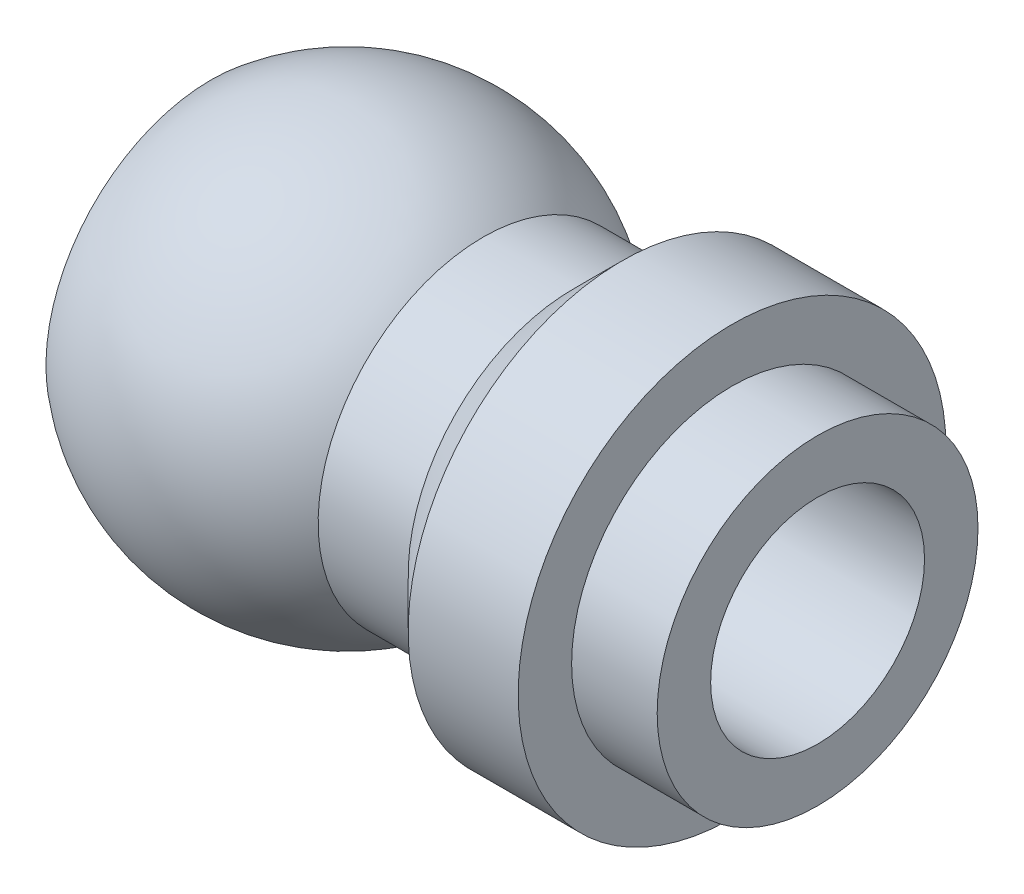
ISO-10303-21;
HEADER;
FILE_DESCRIPTION(('STEP AP214'),'2;1');
FILE_NAME('part.step','',(''),(''),'','','');
FILE_SCHEMA(('AUTOMOTIVE_DESIGN { 1 0 10303 214 1 1 1 1 }'));
ENDSEC;
DATA;
#1=APPLICATION_CONTEXT('core data for automotive mechanical design processes');
#2=APPLICATION_PROTOCOL_DEFINITION('international standard','automotive_design',2000,#1);
#3=PRODUCT_CONTEXT('',#1,'mechanical');
#4=PRODUCT('Part','Part','',(#3));
#5=PRODUCT_RELATED_PRODUCT_CATEGORY('part','',(#4));
#6=PRODUCT_DEFINITION_FORMATION('','',#4);
#7=PRODUCT_DEFINITION_CONTEXT('part definition',#1,'design');
#8=PRODUCT_DEFINITION('design','',#6,#7);
#9=PRODUCT_DEFINITION_SHAPE('','',#8);
#10=(LENGTH_UNIT() NAMED_UNIT(*) SI_UNIT(.MILLI.,.METRE.));
#11=(NAMED_UNIT(*) PLANE_ANGLE_UNIT() SI_UNIT($,.RADIAN.));
#12=(NAMED_UNIT(*) SI_UNIT($,.STERADIAN.) SOLID_ANGLE_UNIT());
#13=UNCERTAINTY_MEASURE_WITH_UNIT(LENGTH_MEASURE(1.E-05),#10,'distance_accuracy_value','');
#14=(GEOMETRIC_REPRESENTATION_CONTEXT(3) GLOBAL_UNCERTAINTY_ASSIGNED_CONTEXT((#13)) GLOBAL_UNIT_ASSIGNED_CONTEXT((#10,
#11,#12)) REPRESENTATION_CONTEXT('',''));
#15=CARTESIAN_POINT('',(0.,0.,0.));
#16=DIRECTION('',(0.,0.,1.));
#17=DIRECTION('',(1.,0.,0.));
#18=AXIS2_PLACEMENT_3D('',#15,#16,#17);
#19=CARTESIAN_POINT('',(0.,0.,0.));
#20=DIRECTION('',(-1.,0.,0.));
#21=DIRECTION('',(0.,0.,1.));
#22=AXIS2_PLACEMENT_3D('',#19,#20,#21);
#23=PLANE('',#22);
#24=CARTESIAN_POINT('',(0.,0.,0.));
#25=DIRECTION('',(-1.,0.,0.));
#26=DIRECTION('',(0.,0.,1.));
#27=AXIS2_PLACEMENT_3D('',#24,#25,#26);
#28=CIRCLE('',#27,3.175);
#29=CARTESIAN_POINT('',(0.,0.,3.175));
#30=VERTEX_POINT('',#29);
#31=EDGE_CURVE('E61',#30,#30,#28,.T.);
#32=ORIENTED_EDGE('',*,*,#31,.F.);
#33=EDGE_LOOP('',(#32));
#34=FACE_BOUND('',#33,.T.);
#35=CARTESIAN_POINT('',(0.,0.,0.));
#36=DIRECTION('',(1.,0.,0.));
#37=DIRECTION('',(0.,0.,-1.));
#38=AXIS2_PLACEMENT_3D('',#35,#36,#37);
#39=CIRCLE('',#38,4.89857161);
#40=CARTESIAN_POINT('',(0.,4.89857161,0.));
#41=VERTEX_POINT('',#40);
#42=EDGE_CURVE('E10',#41,#41,#39,.T.);
#43=ORIENTED_EDGE('',*,*,#42,.F.);
#44=EDGE_LOOP('',(#43));
#45=FACE_BOUND('',#44,.T.);
#46=ADVANCED_FACE('F30',(#34,#45),#23,.T.);
#47=CARTESIAN_POINT('',(4.04060591764428,0.,0.));
#48=DIRECTION('',(1.,0.,0.));
#49=DIRECTION('',(0.,1.,0.));
#50=AXIS2_PLACEMENT_3D('',#47,#48,#49);
#51=SPHERICAL_SURFACE('',#50,6.35);
#52=CARTESIAN_POINT('',(8.08121183528856,0.,0.));
#53=DIRECTION('',(1.,0.,0.));
#54=DIRECTION('',(0.,0.,-1.));
#55=AXIS2_PLACEMENT_3D('',#52,#53,#54);
#56=CIRCLE('',#55,4.89857161);
#57=CARTESIAN_POINT('',(8.08121183528856,4.89857161,0.));
#58=VERTEX_POINT('',#57);
#59=EDGE_CURVE('E36',#58,#58,#56,.T.);
#60=CARTESIAN_POINT('',(0.,4.89857161,0.));
#61=CARTESIAN_POINT('',(0.0703868966275348,4.9566322161133,0.));
#62=CARTESIAN_POINT('',(0.142026745262298,5.01317366958691,0.));
#63=CARTESIAN_POINT('',(0.287675772810518,5.12311782032994,0.));
#64=CARTESIAN_POINT('',(0.361684951723975,5.17652051759937,0.));
#65=CARTESIAN_POINT('',(0.511936066093815,5.28008670500926,0.));
#66=CARTESIAN_POINT('',(0.588178001550199,5.33025019514973,0.));
#67=CARTESIAN_POINT('',(0.742752727434214,5.42724509817358,0.));
#68=CARTESIAN_POINT('',(0.821085517861847,5.47407651105696,0.));
#69=CARTESIAN_POINT('',(0.979696483504205,5.56432016152081,0.));
#70=CARTESIAN_POINT('',(1.05997465871893,5.60773239910127,0.));
#71=CARTESIAN_POINT('',(1.22232722467306,5.69105706569516,0.));
#72=CARTESIAN_POINT('',(1.30440161541246,5.73096949470859,0.));
#73=CARTESIAN_POINT('',(1.47019412859936,5.80722038324899,0.));
#74=CARTESIAN_POINT('',(1.55391225104686,5.84355884277596,0.));
#75=CARTESIAN_POINT('',(1.72283668381197,5.91259427966993,0.));
#76=CARTESIAN_POINT('',(1.80804299412956,5.94529125703692,0.));
#77=CARTESIAN_POINT('',(1.97978549547462,6.00698298040426,0.));
#78=CARTESIAN_POINT('',(2.06632168650208,6.0359777264046,0.));
#79=CARTESIAN_POINT('',(2.24056317084257,6.09021111690329,0.));
#80=CARTESIAN_POINT('',(2.3282684641556,6.11544976140163,0.));
#81=CARTESIAN_POINT('',(2.50468520264771,6.16212405718602,0.));
#82=CARTESIAN_POINT('',(2.5933966478268,6.18355970847206,0.));
#83=CARTESIAN_POINT('',(2.77166087023872,6.22258819186471,0.));
#84=CARTESIAN_POINT('',(2.86121364747157,6.24018102397132,0.));
#85=CARTESIAN_POINT('',(3.04099415104962,6.27149118272237,0.));
#86=CARTESIAN_POINT('',(3.13122187739483,6.28520850936682,0.));
#87=CARTESIAN_POINT('',(3.31218464224464,6.30874217133824,0.));
#88=CARTESIAN_POINT('',(3.40291968074923,6.31855850666522,0.));
#89=CARTESIAN_POINT('',(3.58472849041408,6.33427194792101,0.));
#90=CARTESIAN_POINT('',(3.67580226157434,6.34016905384982,0.));
#91=CARTESIAN_POINT('',(3.85811932770449,6.34803307988932,0.));
#92=CARTESIAN_POINT('',(3.94936262267439,6.35,0.));
#93=CARTESIAN_POINT('',(4.13184921261418,6.35,0.));
#94=CARTESIAN_POINT('',(4.22309250758407,6.34803307988932,0.));
#95=CARTESIAN_POINT('',(4.40540957371422,6.34016905384982,0.));
#96=CARTESIAN_POINT('',(4.49648334487448,6.33427194792101,0.));
#97=CARTESIAN_POINT('',(4.67829215453933,6.31855850666522,0.));
#98=CARTESIAN_POINT('',(4.76902719304393,6.30874217133824,0.));
#99=CARTESIAN_POINT('',(4.94998995789373,6.28520850936682,0.));
#100=CARTESIAN_POINT('',(5.04021768423894,6.27149118272237,0.));
#101=CARTESIAN_POINT('',(5.219998187817,6.24018102397132,0.));
#102=CARTESIAN_POINT('',(5.30955096504984,6.22258819186471,0.));
#103=CARTESIAN_POINT('',(5.48781518746176,6.18355970847206,0.));
#104=CARTESIAN_POINT('',(5.57652663264085,6.16212405718601,0.));
#105=CARTESIAN_POINT('',(5.75294337113296,6.11544976140163,0.));
#106=CARTESIAN_POINT('',(5.84064866444599,6.09021111690329,0.));
#107=CARTESIAN_POINT('',(6.01489014878648,6.0359777264046,0.));
#108=CARTESIAN_POINT('',(6.10142633981394,6.00698298040425,0.));
#109=CARTESIAN_POINT('',(6.273168841159,5.94529125703692,0.));
#110=CARTESIAN_POINT('',(6.3583751514766,5.91259427966993,0.));
#111=CARTESIAN_POINT('',(6.5272995842417,5.84355884277596,0.));
#112=CARTESIAN_POINT('',(6.6110177066892,5.80722038324899,0.));
#113=CARTESIAN_POINT('',(6.7768102198761,5.73096949470859,0.));
#114=CARTESIAN_POINT('',(6.8588846106155,5.69105706569516,0.));
#115=CARTESIAN_POINT('',(7.02123717656963,5.60773239910127,0.));
#116=CARTESIAN_POINT('',(7.10151535178436,5.56432016152081,0.));
#117=CARTESIAN_POINT('',(7.26012631742671,5.47407651105696,0.));
#118=CARTESIAN_POINT('',(7.33845910785435,5.42724509817358,0.));
#119=CARTESIAN_POINT('',(7.49303383373836,5.33025019514973,0.));
#120=CARTESIAN_POINT('',(7.56927576919475,5.28008670500926,0.));
#121=CARTESIAN_POINT('',(7.71952688356459,5.17652051759936,0.));
#122=CARTESIAN_POINT('',(7.79353606247804,5.12311782032994,0.));
#123=CARTESIAN_POINT('',(7.93918509002626,5.0131736695869,0.));
#124=CARTESIAN_POINT('',(8.01082493866103,4.9566322161133,0.));
#125=CARTESIAN_POINT('',(8.08121183528856,4.89857161,0.));
#126=B_SPLINE_CURVE_WITH_KNOTS('',3,(#60,#61,#62,#63,#64,#65,#66,#67,#68,#69,#70,#71,#72,#73,
#74,#75,#76,#77,#78,#79,#80,#81,#82,#83,#84,#85,#86,#87,#88,#89,#90,#91,#92,#93,#94,#95,#96,#97,
#98,#99,#100,#101,#102,#103,#104,#105,#106,#107,#108,#109,#110,#111,#112,#113,#114,#115,#116,
#117,#118,#119,#120,#121,#122,#123,#124,#125),.UNSPECIFIED.,.F.,.F.,(4,2,2,2,2,2,2,2,2,2,2,2,2,
2,2,2,2,2,2,2,2,2,2,2,2,2,2,2,2,2,2,2,4),(0.,0.273708696895854,0.547417393791707,
0.821126090687559,1.09483478758341,1.36854348447927,1.64225218137512,1.91596087827097,
2.18966957516683,2.46337827206268,2.73708696895853,3.01079566585438,3.28450436275024,
3.55821305964609,3.83192175654194,4.1056304534378,4.37933915033365,4.6530478472295,
4.92675654412535,5.20046524102121,5.47417393791706,5.74788263481291,6.02159133170877,
6.29530002860462,6.56900872550047,6.84271742239633,7.11642611929218,7.39013481618803,
7.66384351308389,7.93755220997974,8.21126090687559,8.48496960377145,8.7586783006673),.UNSPECIFIED.);
#127=EDGE_CURVE('BSEAM69',#41,#58,#126,.T.);
#128=ORIENTED_EDGE('',*,*,#42,.T.);
#129=ORIENTED_EDGE('',*,*,#59,.F.);
#130=ORIENTED_EDGE('',*,*,#127,.T.);
#131=ORIENTED_EDGE('',*,*,#127,.F.);
#132=EDGE_LOOP('',(#128,#130,#129,#131));
#133=FACE_BOUND('',#132,.T.);
#134=ADVANCED_FACE('F69',(#133),#51,.T.);
#135=CARTESIAN_POINT('',(18.0106059176443,0.,0.));
#136=DIRECTION('',(1.,0.,0.));
#137=DIRECTION('',(0.,0.,-1.));
#138=AXIS2_PLACEMENT_3D('',#135,#136,#137);
#139=CYLINDRICAL_SURFACE('',#138,4.89857161);
#140=ORIENTED_EDGE('',*,*,#59,.T.);
#141=EDGE_LOOP('',(#140));
#142=FACE_BOUND('',#141,.T.);
#143=CARTESIAN_POINT('',(10.75346324193,0.,0.));
#144=DIRECTION('',(1.,0.,0.));
#145=DIRECTION('',(0.,0.,-1.));
#146=AXIS2_PLACEMENT_3D('',#143,#144,#145);
#147=CIRCLE('',#146,4.89857161);
#148=CARTESIAN_POINT('',(10.75346324193,0.,-4.89857161));
#149=VERTEX_POINT('',#148);
#150=EDGE_CURVE('E40',#149,#149,#147,.T.);
#151=ORIENTED_EDGE('',*,*,#150,.F.);
#152=EDGE_LOOP('',(#151));
#153=FACE_BOUND('',#152,.T.);
#154=ADVANCED_FACE('F73',(#142,#153),#139,.T.);
#155=CARTESIAN_POINT('',(12.20489163193,0.,0.));
#156=DIRECTION('',(1.,0.,0.));
#157=DIRECTION('',(0.,0.,-1.));
#158=AXIS2_PLACEMENT_3D('',#155,#156,#157);
#159=CONICAL_SURFACE('',#158,6.35,0.78539816339745);
#160=ORIENTED_EDGE('',*,*,#150,.T.);
#161=EDGE_LOOP('',(#160));
#162=FACE_BOUND('',#161,.T.);
#163=CARTESIAN_POINT('',(12.20489163193,0.,0.));
#164=DIRECTION('',(1.,0.,0.));
#165=DIRECTION('',(0.,0.,-1.));
#166=AXIS2_PLACEMENT_3D('',#163,#164,#165);
#167=CIRCLE('',#166,6.35);
#168=CARTESIAN_POINT('',(12.20489163193,0.,-6.35));
#169=VERTEX_POINT('',#168);
#170=EDGE_CURVE('E44',#169,#169,#167,.T.);
#171=ORIENTED_EDGE('',*,*,#170,.F.);
#172=EDGE_LOOP('',(#171));
#173=FACE_BOUND('',#172,.T.);
#174=ADVANCED_FACE('F77',(#162,#173),#159,.T.);
#175=CARTESIAN_POINT('',(18.0106059176443,0.,0.));
#176=DIRECTION('',(1.,0.,0.));
#177=DIRECTION('',(0.,0.,-1.));
#178=AXIS2_PLACEMENT_3D('',#175,#176,#177);
#179=CYLINDRICAL_SURFACE('',#178,6.35);
#180=ORIENTED_EDGE('',*,*,#170,.T.);
#181=EDGE_LOOP('',(#180));
#182=FACE_BOUND('',#181,.T.);
#183=CARTESIAN_POINT('',(15.4706059176443,0.,0.));
#184=DIRECTION('',(1.,0.,0.));
#185=DIRECTION('',(0.,0.,-1.));
#186=AXIS2_PLACEMENT_3D('',#183,#184,#185);
#187=CIRCLE('',#186,6.35);
#188=CARTESIAN_POINT('',(15.4706059176443,0.,-6.35));
#189=VERTEX_POINT('',#188);
#190=EDGE_CURVE('E49',#189,#189,#187,.T.);
#191=ORIENTED_EDGE('',*,*,#190,.F.);
#192=EDGE_LOOP('',(#191));
#193=FACE_BOUND('',#192,.T.);
#194=ADVANCED_FACE('F83',(#182,#193),#179,.T.);
#195=CARTESIAN_POINT('',(15.4706059176443,6.35,0.));
#196=DIRECTION('',(1.,0.,0.));
#197=DIRECTION('',(0.,0.,-1.));
#198=AXIS2_PLACEMENT_3D('',#195,#196,#197);
#199=PLANE('',#198);
#200=ORIENTED_EDGE('',*,*,#190,.T.);
#201=EDGE_LOOP('',(#200));
#202=FACE_BOUND('',#201,.T.);
#203=CARTESIAN_POINT('',(15.4706059176443,0.,0.));
#204=DIRECTION('',(1.,0.,0.));
#205=DIRECTION('',(0.,0.,-1.));
#206=AXIS2_PLACEMENT_3D('',#203,#204,#205);
#207=CIRCLE('',#206,4.7625);
#208=CARTESIAN_POINT('',(15.4706059176443,0.,-4.7625));
#209=VERTEX_POINT('',#208);
#210=EDGE_CURVE('E52',#209,#209,#207,.T.);
#211=ORIENTED_EDGE('',*,*,#210,.F.);
#212=EDGE_LOOP('',(#211));
#213=FACE_BOUND('',#212,.T.);
#214=ADVANCED_FACE('F87',(#202,#213),#199,.T.);
#215=CARTESIAN_POINT('',(18.0106059176443,0.,0.));
#216=DIRECTION('',(1.,0.,0.));
#217=DIRECTION('',(0.,0.,-1.));
#218=AXIS2_PLACEMENT_3D('',#215,#216,#217);
#219=CYLINDRICAL_SURFACE('',#218,4.7625);
#220=ORIENTED_EDGE('',*,*,#210,.T.);
#221=EDGE_LOOP('',(#220));
#222=FACE_BOUND('',#221,.T.);
#223=CARTESIAN_POINT('',(18.0106059176443,0.,0.));
#224=DIRECTION('',(1.,0.,0.));
#225=DIRECTION('',(0.,0.,-1.));
#226=AXIS2_PLACEMENT_3D('',#223,#224,#225);
#227=CIRCLE('',#226,4.7625);
#228=CARTESIAN_POINT('',(18.0106059176443,0.,-4.7625));
#229=VERTEX_POINT('',#228);
#230=EDGE_CURVE('E55',#229,#229,#227,.T.);
#231=ORIENTED_EDGE('',*,*,#230,.F.);
#232=EDGE_LOOP('',(#231));
#233=FACE_BOUND('',#232,.T.);
#234=ADVANCED_FACE('F91',(#222,#233),#219,.T.);
#235=CARTESIAN_POINT('',(18.0106059176443,4.7625,0.));
#236=DIRECTION('',(1.,0.,0.));
#237=DIRECTION('',(0.,0.,-1.));
#238=AXIS2_PLACEMENT_3D('',#235,#236,#237);
#239=PLANE('',#238);
#240=CARTESIAN_POINT('',(18.0106059176443,0.,0.));
#241=DIRECTION('',(-1.,0.,0.));
#242=DIRECTION('',(0.,0.,1.));
#243=AXIS2_PLACEMENT_3D('',#240,#241,#242);
#244=CIRCLE('',#243,3.175);
#245=CARTESIAN_POINT('',(18.0106059176443,0.,3.175));
#246=VERTEX_POINT('',#245);
#247=EDGE_CURVE('E58',#246,#246,#244,.T.);
#248=ORIENTED_EDGE('',*,*,#247,.T.);
#249=EDGE_LOOP('',(#248));
#250=FACE_BOUND('',#249,.T.);
#251=ORIENTED_EDGE('',*,*,#230,.T.);
#252=EDGE_LOOP('',(#251));
#253=FACE_BOUND('',#252,.T.);
#254=ADVANCED_FACE('F95',(#250,#253),#239,.T.);
#255=CARTESIAN_POINT('',(0.,0.,0.));
#256=DIRECTION('',(-1.,0.,0.));
#257=DIRECTION('',(0.,0.,1.));
#258=AXIS2_PLACEMENT_3D('',#255,#256,#257);
#259=CYLINDRICAL_SURFACE('',#258,3.175);
#260=ORIENTED_EDGE('',*,*,#247,.F.);
#261=EDGE_LOOP('',(#260));
#262=FACE_BOUND('',#261,.T.);
#263=ORIENTED_EDGE('',*,*,#31,.T.);
#264=EDGE_LOOP('',(#263));
#265=FACE_BOUND('',#264,.T.);
#266=ADVANCED_FACE('F65',(#262,#265),#259,.F.);
#267=CLOSED_SHELL('',(#46,#134,#154,#174,#194,#214,#234,#254,#266));
#268=MANIFOLD_SOLID_BREP('B2',#267);
#269=ADVANCED_BREP_SHAPE_REPRESENTATION('',(#18,#268),#14);
#270=SHAPE_DEFINITION_REPRESENTATION(#9,#269);
ENDSEC;
END-ISO-10303-21;
